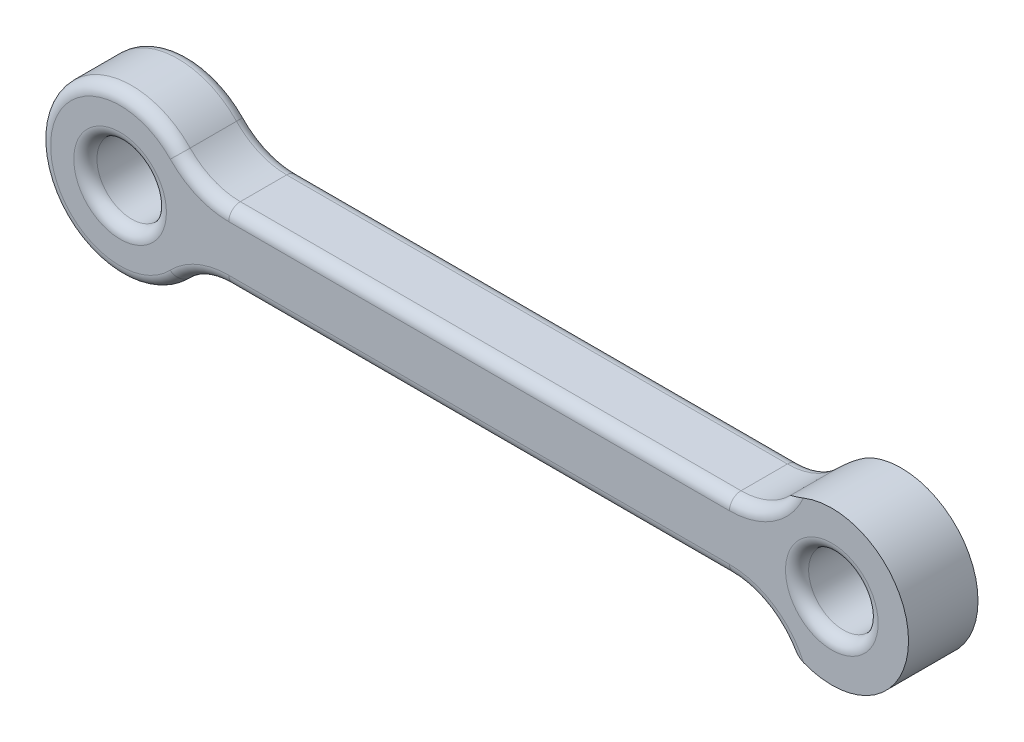
ISO-10303-21;
HEADER;
FILE_DESCRIPTION(('STEP AP214'),'2;1');
FILE_NAME('part.step','',(''),(''),'','','');
FILE_SCHEMA(('AUTOMOTIVE_DESIGN { 1 0 10303 214 1 1 1 1 }'));
ENDSEC;
DATA;
#1=APPLICATION_CONTEXT('core data for automotive mechanical design processes');
#2=APPLICATION_PROTOCOL_DEFINITION('international standard','automotive_design',2000,#1);
#3=PRODUCT_CONTEXT('',#1,'mechanical');
#4=PRODUCT('Part','Part','',(#3));
#5=PRODUCT_RELATED_PRODUCT_CATEGORY('part','',(#4));
#6=PRODUCT_DEFINITION_FORMATION('','',#4);
#7=PRODUCT_DEFINITION_CONTEXT('part definition',#1,'design');
#8=PRODUCT_DEFINITION('design','',#6,#7);
#9=PRODUCT_DEFINITION_SHAPE('','',#8);
#10=(LENGTH_UNIT() NAMED_UNIT(*) SI_UNIT(.MILLI.,.METRE.));
#11=(NAMED_UNIT(*) PLANE_ANGLE_UNIT() SI_UNIT($,.RADIAN.));
#12=(NAMED_UNIT(*) SI_UNIT($,.STERADIAN.) SOLID_ANGLE_UNIT());
#13=UNCERTAINTY_MEASURE_WITH_UNIT(LENGTH_MEASURE(1.E-05),#10,'distance_accuracy_value','');
#14=(GEOMETRIC_REPRESENTATION_CONTEXT(3) GLOBAL_UNCERTAINTY_ASSIGNED_CONTEXT((#13)) GLOBAL_UNIT_ASSIGNED_CONTEXT((#10,
#11,#12)) REPRESENTATION_CONTEXT('',''));
#15=CARTESIAN_POINT('',(0.,0.,0.));
#16=DIRECTION('',(0.,0.,1.));
#17=DIRECTION('',(1.,0.,0.));
#18=AXIS2_PLACEMENT_3D('',#15,#16,#17);
#19=CARTESIAN_POINT('',(36.507363881839,8.54999798456547,-4.34824322805021));
#20=DIRECTION('',(0.,0.,1.));
#21=DIRECTION('',(1.,0.,0.));
#22=AXIS2_PLACEMENT_3D('',#19,#20,#21);
#23=CYLINDRICAL_SURFACE('',#22,5.7);
#24=DIRECTION('',(0.,0.,1.));
#25=VECTOR('',#24,1.);
#26=CARTESIAN_POINT('',(40.6204977019919,4.60384413841163,-4.34824322805021));
#27=LINE('',#26,#25);
#28=CARTESIAN_POINT('',(40.6204977019919,4.60384413841163,-3.39824322805021));
#29=VERTEX_POINT('',#28);
#30=CARTESIAN_POINT('',(40.6204977019919,4.60384413841163,0.401756771949787));
#31=VERTEX_POINT('',#30);
#32=EDGE_CURVE('E150',#29,#31,#27,.T.);
#33=ORIENTED_EDGE('',*,*,#32,.F.);
#34=CARTESIAN_POINT('',(36.507363881839,8.54999798456547,-3.39824322805021));
#35=DIRECTION('',(0.,0.,1.));
#36=DIRECTION('',(1.,0.,0.));
#37=AXIS2_PLACEMENT_3D('',#34,#35,#36);
#38=CIRCLE('',#37,5.7);
#39=CARTESIAN_POINT('',(36.507363881839,2.84999798456547,-3.39824322805021));
#40=VERTEX_POINT('',#39);
#41=EDGE_CURVE('E163',#29,#40,#38,.F.);
#42=ORIENTED_EDGE('',*,*,#41,.T.);
#43=DIRECTION('',(0.,0.,1.));
#44=VECTOR('',#43,1.);
#45=CARTESIAN_POINT('',(36.507363881839,2.84999798456547,-4.34824322805021));
#46=LINE('',#45,#44);
#47=CARTESIAN_POINT('',(36.507363881839,2.84999798456547,0.401756771949787));
#48=VERTEX_POINT('',#47);
#49=EDGE_CURVE('E352',#40,#48,#46,.T.);
#50=ORIENTED_EDGE('',*,*,#49,.T.);
#51=CARTESIAN_POINT('',(36.507363881839,8.54999798456547,0.401756771949787));
#52=DIRECTION('',(0.,0.,1.));
#53=DIRECTION('',(1.,0.,0.));
#54=AXIS2_PLACEMENT_3D('',#51,#52,#53);
#55=CIRCLE('',#54,5.7);
#56=EDGE_CURVE('E166',#48,#31,#55,.T.);
#57=ORIENTED_EDGE('',*,*,#56,.T.);
#58=EDGE_LOOP('',(#33,#42,#50,#57));
#59=FACE_BOUND('',#58,.T.);
#60=ADVANCED_FACE('F34',(#59),#23,.F.);
#61=CARTESIAN_POINT('',(44.9061538255036,-2.01543452817728E-06,-4.34824322805021));
#62=DIRECTION('',(0.,0.,1.));
#63=DIRECTION('',(1.,0.,0.));
#64=AXIS2_PLACEMENT_3D('',#61,#62,#63);
#65=CYLINDRICAL_SURFACE('',#64,6.28985276594588);
#66=CARTESIAN_POINT('',(44.9061538255036,-2.01543452817728E-06,-4.34824322805021));
#67=DIRECTION('',(0.,0.,1.));
#68=DIRECTION('',(1.,0.,0.));
#69=AXIS2_PLACEMENT_3D('',#66,#67,#68);
#70=CIRCLE('',#69,6.28985276594588);
#71=CARTESIAN_POINT('',(42.5822666346649,-5.84481134864062,-4.34824322805021));
#72=VERTEX_POINT('',#71);
#73=CARTESIAN_POINT('',(42.5822666346649,5.84480731777156,-4.34824322805021));
#74=VERTEX_POINT('',#73);
#75=EDGE_CURVE('E153',#72,#74,#70,.T.);
#76=ORIENTED_EDGE('',*,*,#75,.T.);
#77=CARTESIAN_POINT('',(42.5822666346649,5.84480731777156,-4.34824322805021));
#78=CARTESIAN_POINT('',(42.5242618563185,5.82175204910267,-4.34822515141585));
#79=CARTESIAN_POINT('',(42.4666746223335,5.79784858913652,-4.34524316438347));
#80=CARTESIAN_POINT('',(42.3527633507371,5.74858595511516,-4.33416356835211));
#81=CARTESIAN_POINT('',(42.2964368465661,5.72323004728076,-4.32607705706841));
#82=CARTESIAN_POINT('',(42.1856638687273,5.67140875915757,-4.30567512232448));
#83=CARTESIAN_POINT('',(42.1312059977327,5.64495381874012,-4.29339387879264));
#84=CARTESIAN_POINT('',(42.0237939570263,5.59087148781972,-4.26522584736886));
#85=CARTESIAN_POINT('',(41.9708408061495,5.56324333309582,-4.24933667908465));
#86=CARTESIAN_POINT('',(41.8221034724079,5.48296479256332,-4.19970011858928));
#87=CARTESIAN_POINT('',(41.7282340708054,5.42903592653977,-4.16226529448975));
#88=CARTESIAN_POINT('',(41.5458123056734,5.31805875802067,-4.07982154740148));
#89=CARTESIAN_POINT('',(41.4572643512373,5.2610079416034,-4.03480645804254));
#90=CARTESIAN_POINT('',(41.2848725540442,5.1438751997565,-3.93906267830923));
#91=CARTESIAN_POINT('',(41.2010474649142,5.08378277401554,-3.88831332722491));
#92=CARTESIAN_POINT('',(41.0381411029469,4.96095603141131,-3.78272378725785));
#93=CARTESIAN_POINT('',(40.959057323986,4.89822314061,-3.72788579453001));
#94=CARTESIAN_POINT('',(40.8453620579264,4.80359528587045,-3.64302819488221));
#95=CARTESIAN_POINT('',(40.8088171468472,4.77245238138413,-3.61476708299693));
#96=CARTESIAN_POINT('',(40.7504107057862,4.72153962964591,-3.56671383655738));
#97=CARTESIAN_POINT('',(40.7280357677093,4.7017461442844,-3.54757259428625));
#98=CARTESIAN_POINT('',(40.6924047935437,4.66978508713483,-3.5144124247386));
#99=CARTESIAN_POINT('',(40.6787625997997,4.65743444145288,-3.50102627191423));
#100=CARTESIAN_POINT('',(40.6592910947883,4.63966229324642,-3.47925716911045));
#101=CARTESIAN_POINT('',(40.6529359231323,4.6338360003273,-3.47167589167288));
#102=CARTESIAN_POINT('',(40.64094571925,4.62280134877191,-3.45552743347919));
#103=CARTESIAN_POINT('',(40.635306827475,4.61758969021817,-3.44696605456954));
#104=CARTESIAN_POINT('',(40.628969320766,4.61171632920766,-3.43418077629506));
#105=CARTESIAN_POINT('',(40.6274381296364,4.61029551728388,-3.43074380067925));
#106=CARTESIAN_POINT('',(40.6247442856036,4.60779392188491,-3.42362793846728));
#107=CARTESIAN_POINT('',(40.6235794422702,4.60671111772935,-3.41995065486843));
#108=CARTESIAN_POINT('',(40.6219801448462,4.60522378466562,-3.41328844419325));
#109=CARTESIAN_POINT('',(40.6214368282799,4.60471822463415,-3.41035349663978));
#110=CARTESIAN_POINT('',(40.6206899682158,4.60402311984708,-3.40436475071507));
#111=CARTESIAN_POINT('',(40.6204911325881,4.6038379538184,-3.40130988031463));
#112=CARTESIAN_POINT('',(40.6204977019919,4.60384413841163,-3.39824322805021));
#113=B_SPLINE_CURVE_WITH_KNOTS('',3,(#77,#78,#79,#80,#81,#82,#83,#84,#85,#86,#87,#88,#89,#90,
#91,#92,#93,#94,#95,#96,#97,#98,#99,#100,#101,#102,#103,#104,#105,#106,#107,#108,#109,#110,#111,
#112),.UNSPECIFIED.,.F.,.F.,(4,2,2,2,2,2,2,2,2,2,2,2,2,2,2,2,2,4),(0.,0.187072185321937,
0.373739052357077,0.558919819248967,0.744223119268283,1.08727931315702,1.43061593549753,
1.77523162456193,2.11966352363416,2.28676133383489,2.39318610297405,2.46134589936488,
2.49578051675705,2.53002091666069,2.54206010118796,2.55402586999796,2.5630721675609,
2.57224114939772),.UNSPECIFIED.);
#114=EDGE_CURVE('E147',#74,#29,#113,.T.);
#115=ORIENTED_EDGE('',*,*,#114,.T.);
#116=ORIENTED_EDGE('',*,*,#32,.T.);
#117=CARTESIAN_POINT('',(40.6204977019919,4.60384413841163,0.401756771949787));
#118=CARTESIAN_POINT('',(40.6204858693804,4.60383299452611,0.405469727053923));
#119=CARTESIAN_POINT('',(40.620779386017,4.60410636538471,0.409155465137005));
#120=CARTESIAN_POINT('',(40.6218547641134,4.60510712453065,0.416311365692683));
#121=CARTESIAN_POINT('',(40.6226257614643,4.6058244121492,0.419784484629862));
#122=CARTESIAN_POINT('',(40.6249476641261,4.60798287648919,0.427946509291284));
#123=CARTESIAN_POINT('',(40.6266904040677,4.60960181142327,0.432529760587125));
#124=CARTESIAN_POINT('',(40.6306671470762,4.61329067007513,0.441332025326628));
#125=CARTESIAN_POINT('',(40.6329064403375,4.61536544789263,0.445546377509347));
#126=CARTESIAN_POINT('',(40.644896642457,4.62645445202731,0.466121909048936));
#127=CARTESIAN_POINT('',(40.6566662314761,4.63727691501406,0.480193036958769));
#128=CARTESIAN_POINT('',(40.6811637973935,4.65961212007277,0.506785148334278));
#129=CARTESIAN_POINT('',(40.6938995850088,4.67113028989664,0.519290704535989));
#130=CARTESIAN_POINT('',(40.7323509740006,4.70560807873407,0.555154404179497));
#131=CARTESIAN_POINT('',(40.7588057162045,4.72895106329035,0.577424060185287));
#132=CARTESIAN_POINT('',(40.8125845861007,4.77558448348195,0.620941290658611));
#133=CARTESIAN_POINT('',(40.8399099982111,4.79887478151696,0.642187226803431));
#134=CARTESIAN_POINT('',(40.8951582804262,4.8451450089714,0.683874577308413));
#135=CARTESIAN_POINT('',(40.9230777776064,4.86812587843941,0.704319276084132));
#136=CARTESIAN_POINT('',(40.9795327360087,4.91377596131083,0.744638912574169));
#137=CARTESIAN_POINT('',(41.0080678458169,4.93644534102658,0.76451416101505));
#138=CARTESIAN_POINT('',(41.1113204122242,5.01700836525966,0.834715075878338));
#139=CARTESIAN_POINT('',(41.18779212466,5.07398205359427,0.883551423288489));
#140=CARTESIAN_POINT('',(41.3450421431309,5.18555866895236,0.977006774991059));
#141=CARTESIAN_POINT('',(41.4258234756812,5.24015987970276,1.02162275281196));
#142=CARTESIAN_POINT('',(41.5916575082006,5.34658828284597,1.10498374307163));
#143=CARTESIAN_POINT('',(41.6766932840772,5.39842499849608,1.14374988337509));
#144=CARTESIAN_POINT('',(41.8514347545614,5.49918896166012,1.2136235045875));
#145=CARTESIAN_POINT('',(41.9411356494258,5.54811909276127,1.24473867552976));
#146=CARTESIAN_POINT('',(42.1206269996037,5.64027501491988,1.2954589700484));
#147=CARTESIAN_POINT('',(42.2101849945424,5.68366402211963,1.31556524676431));
#148=CARTESIAN_POINT('',(42.347488232458,5.7461300015814,1.33667465308559));
#149=CARTESIAN_POINT('',(42.3939186714196,5.7665828967427,1.34220609390733));
#150=CARTESIAN_POINT('',(42.4875633635927,5.80648310759377,1.34974586982785));
#151=CARTESIAN_POINT('',(42.5347786168032,5.8259289856779,1.35174929601289));
#152=CARTESIAN_POINT('',(42.5822666346649,5.84480731777156,1.35175677194979));
#153=B_SPLINE_CURVE_WITH_KNOTS('',3,(#117,#118,#119,#120,#121,#122,#123,#124,#125,#126,#127,
#128,#129,#130,#131,#132,#133,#134,#135,#136,#137,#138,#139,#140,#141,#142,#143,#144,#145,#146,
#147,#148,#149,#150,#151,#152),.UNSPECIFIED.,.F.,.F.,(4,2,2,2,2,2,2,2,2,2,2,2,2,2,2,2,2,4),(0.,
0.0110739084922642,0.0219046668590552,0.0373073278328187,0.0528827253417691,0.116116367250972,
0.179930883142027,0.30491919696137,0.430101310650094,0.554700754135241,0.679230861196915,
1.00045851346037,1.32191480232596,1.64218076968114,1.96212350785099,2.26593791227511,
2.41892334464954,2.57212147474342),.UNSPECIFIED.);
#154=CARTESIAN_POINT('',(42.5822666346649,5.84480731777156,1.35175677194979));
#155=VERTEX_POINT('',#154);
#156=EDGE_CURVE('E202',#31,#155,#153,.T.);
#157=ORIENTED_EDGE('',*,*,#156,.T.);
#158=CARTESIAN_POINT('',(44.9061538255036,-2.01543452817728E-06,1.35175677194979));
#159=DIRECTION('',(0.,0.,1.));
#160=DIRECTION('',(1.,0.,0.));
#161=AXIS2_PLACEMENT_3D('',#158,#159,#160);
#162=CIRCLE('',#161,6.28985276594588);
#163=CARTESIAN_POINT('',(42.5822666346649,-5.84481134864062,1.35175677194979));
#164=VERTEX_POINT('',#163);
#165=EDGE_CURVE('E347',#164,#155,#162,.T.);
#166=ORIENTED_EDGE('',*,*,#165,.F.);
#167=CARTESIAN_POINT('',(42.5822666346649,-5.84481134864062,1.35175677194979));
#168=CARTESIAN_POINT('',(42.5242618563185,-5.82175607997173,1.35173869531543));
#169=CARTESIAN_POINT('',(42.4666746223335,-5.79785262000558,1.34875670828305));
#170=CARTESIAN_POINT('',(42.3527633507371,-5.74858998598422,1.33767711225168));
#171=CARTESIAN_POINT('',(42.2964368465661,-5.72323407814981,1.32959060096798));
#172=CARTESIAN_POINT('',(42.1856638687273,-5.67141279002663,1.30918866622405));
#173=CARTESIAN_POINT('',(42.1312059977327,-5.64495784960917,1.29690742269221));
#174=CARTESIAN_POINT('',(42.0237939570263,-5.59087551868877,1.26873939126844));
#175=CARTESIAN_POINT('',(41.9708408061495,-5.56324736396488,1.25285022298422));
#176=CARTESIAN_POINT('',(41.8221034724079,-5.48296882343237,1.20321366248886));
#177=CARTESIAN_POINT('',(41.7282340708054,-5.42903995740883,1.16577883838932));
#178=CARTESIAN_POINT('',(41.5458123056735,-5.31806278888973,1.08333509130105));
#179=CARTESIAN_POINT('',(41.4572643512373,-5.26101197247245,1.03832000194212));
#180=CARTESIAN_POINT('',(41.2848725540442,-5.14387923062555,0.942576222208803));
#181=CARTESIAN_POINT('',(41.2010474649142,-5.0837868048846,0.891826871124481));
#182=CARTESIAN_POINT('',(41.0381411029469,-4.96096006228036,0.786237331157426));
#183=CARTESIAN_POINT('',(40.959057323986,-4.89822717147906,0.731399338429579));
#184=CARTESIAN_POINT('',(40.8453620579265,-4.80359931673953,0.646541738781803));
#185=CARTESIAN_POINT('',(40.8088171468473,-4.77245641225323,0.618280626896551));
#186=CARTESIAN_POINT('',(40.7504107057863,-4.72154366051503,0.570227380457024));
#187=CARTESIAN_POINT('',(40.7280357677094,-4.70175017515352,0.551086138185899));
#188=CARTESIAN_POINT('',(40.6924047935438,-4.66978911800395,0.517925968638235));
#189=CARTESIAN_POINT('',(40.6787625997998,-4.657438472322,0.504539815813861));
#190=CARTESIAN_POINT('',(40.6592910947883,-4.63966632411552,0.482770713010082));
#191=CARTESIAN_POINT('',(40.6529359231324,-4.63384003119639,0.475189435572518));
#192=CARTESIAN_POINT('',(40.64094571925,-4.62280537964101,0.459040977378818));
#193=CARTESIAN_POINT('',(40.6353068274751,-4.61759372108727,0.450479598469155));
#194=CARTESIAN_POINT('',(40.628969320766,-4.61172036007674,0.437694320194676));
#195=CARTESIAN_POINT('',(40.6274381296364,-4.61029954815296,0.434257344578873));
#196=CARTESIAN_POINT('',(40.6247442856036,-4.60779795275398,0.427141482366901));
#197=CARTESIAN_POINT('',(40.6235794422702,-4.60671514859842,0.423464198768058));
#198=CARTESIAN_POINT('',(40.6219801448462,-4.60522781553467,0.41680198809287));
#199=CARTESIAN_POINT('',(40.6214368282799,-4.60472225550319,0.413867040539391));
#200=CARTESIAN_POINT('',(40.6206899682158,-4.60402715071611,0.407878294614674));
#201=CARTESIAN_POINT('',(40.6204911325881,-4.60384198468743,0.40482342421422));
#202=CARTESIAN_POINT('',(40.6204977019919,-4.60384816928067,0.401756771949791));
#203=B_SPLINE_CURVE_WITH_KNOTS('',3,(#167,#168,#169,#170,#171,#172,#173,#174,#175,#176,#177,
#178,#179,#180,#181,#182,#183,#184,#185,#186,#187,#188,#189,#190,#191,#192,#193,#194,#195,#196,
#197,#198,#199,#200,#201,#202),.UNSPECIFIED.,.F.,.F.,(4,2,2,2,2,2,2,2,2,2,2,2,2,2,2,2,2,4),(0.,
0.187072185321944,0.373739052357085,0.558919819248975,0.744223119268284,1.08727931315701,
1.43061593549753,1.77523162456193,2.11966352363416,2.28676133383477,2.39318610297392,
2.46134589936479,2.49578051675697,2.53002091666063,2.54206010118791,2.55402586999791,
2.56307216756087,2.57224114939773),.UNSPECIFIED.);
#204=CARTESIAN_POINT('',(40.6204977019919,-4.60384816928068,0.401756771949787));
#205=VERTEX_POINT('',#204);
#206=EDGE_CURVE('E194',#164,#205,#203,.T.);
#207=ORIENTED_EDGE('',*,*,#206,.T.);
#208=DIRECTION('',(0.,0.,1.));
#209=VECTOR('',#208,1.);
#210=CARTESIAN_POINT('',(40.6204977019919,-4.60384816928068,-4.34824322805021));
#211=LINE('',#210,#209);
#212=CARTESIAN_POINT('',(40.6204977019919,-4.60384816928068,-3.39824322805021));
#213=VERTEX_POINT('',#212);
#214=EDGE_CURVE('E167',#213,#205,#211,.T.);
#215=ORIENTED_EDGE('',*,*,#214,.F.);
#216=CARTESIAN_POINT('',(40.6204977019919,-4.60384816928068,-3.39824322805021));
#217=CARTESIAN_POINT('',(40.6204858693804,-4.60383702539517,-3.40195618315435));
#218=CARTESIAN_POINT('',(40.6207793860169,-4.60411039625377,-3.40564192123743));
#219=CARTESIAN_POINT('',(40.6218547641134,-4.60511115539971,-3.41279782179311));
#220=CARTESIAN_POINT('',(40.6226257614643,-4.60582844301827,-3.41627094073029));
#221=CARTESIAN_POINT('',(40.6249476641261,-4.60798690735825,-3.42443296539171));
#222=CARTESIAN_POINT('',(40.6266904040677,-4.60960584229233,-3.42901621668754));
#223=CARTESIAN_POINT('',(40.6306671470762,-4.61329470094418,-3.43781848142704));
#224=CARTESIAN_POINT('',(40.6329064403374,-4.61536947876168,-3.44203283360976));
#225=CARTESIAN_POINT('',(40.644896642457,-4.62645848289633,-3.46260836514933));
#226=CARTESIAN_POINT('',(40.6566662314761,-4.63728094588307,-3.47667949305915));
#227=CARTESIAN_POINT('',(40.6811637973935,-4.65961615094176,-3.50327160443464));
#228=CARTESIAN_POINT('',(40.6938995850088,-4.67113432076563,-3.51577716063634));
#229=CARTESIAN_POINT('',(40.7323509740005,-4.70561210960303,-3.55164086027983));
#230=CARTESIAN_POINT('',(40.7588057162044,-4.72895509415929,-3.5739105162856));
#231=CARTESIAN_POINT('',(40.8125845861005,-4.77558851435085,-3.61742774675889));
#232=CARTESIAN_POINT('',(40.8399099982109,-4.79887881238585,-3.6386736829037));
#233=CARTESIAN_POINT('',(40.895158280426,-4.84514903984024,-3.68036103340865));
#234=CARTESIAN_POINT('',(40.9230777776061,-4.86812990930824,-3.70080573218435));
#235=CARTESIAN_POINT('',(40.9795327360084,-4.91377999217962,-3.74112536867436));
#236=CARTESIAN_POINT('',(41.0080678458166,-4.93644937189534,-3.76100061711522));
#237=CARTESIAN_POINT('',(41.1113204122238,-5.01701239612841,-3.8312015319785));
#238=CARTESIAN_POINT('',(41.1877921246596,-5.07398608446301,-3.88003787938865));
#239=CARTESIAN_POINT('',(41.3450421431304,-5.18556269982111,-3.97349323109123));
#240=CARTESIAN_POINT('',(41.4258234756807,-5.24016391057152,-4.01810920891214));
#241=CARTESIAN_POINT('',(41.5916575082002,-5.34659231371473,-4.10147019917183));
#242=CARTESIAN_POINT('',(41.6766932840768,-5.39842902936486,-4.1402363394753));
#243=CARTESIAN_POINT('',(41.8514347545609,-5.4991929925289,-4.21010996068775));
#244=CARTESIAN_POINT('',(41.9411356494253,-5.54812312363005,-4.24122513163002));
#245=CARTESIAN_POINT('',(42.1206269996032,-5.64027904578873,-4.29194542614872));
#246=CARTESIAN_POINT('',(42.2101849945421,-5.68366805298853,-4.31205170286467));
#247=CARTESIAN_POINT('',(42.3474882324578,-5.74613403245037,-4.33316110918599));
#248=CARTESIAN_POINT('',(42.3939186714194,-5.76658692761169,-4.33869255000773));
#249=CARTESIAN_POINT('',(42.4875633635926,-5.80648713846279,-4.34623232592827));
#250=CARTESIAN_POINT('',(42.5347786168031,-5.82593301654694,-4.34823575211331));
#251=CARTESIAN_POINT('',(42.5822666346649,-5.84481134864062,-4.34824322805021));
#252=B_SPLINE_CURVE_WITH_KNOTS('',3,(#216,#217,#218,#219,#220,#221,#222,#223,#224,#225,#226,
#227,#228,#229,#230,#231,#232,#233,#234,#235,#236,#237,#238,#239,#240,#241,#242,#243,#244,#245,
#246,#247,#248,#249,#250,#251),.UNSPECIFIED.,.F.,.F.,(4,2,2,2,2,2,2,2,2,2,2,2,2,2,2,2,2,4),(0.,
0.011073908492264,0.0219046668590601,0.037307327832808,0.0528827253417396,0.116116367250877,
0.179930883141882,0.304919196961123,0.430101310649748,0.554700754134783,0.67923086119634,
1.00045851345979,1.32191480232537,1.64218076968055,1.96212350785041,2.26593791227483,
2.4189233446494,2.57212147474342),.UNSPECIFIED.);
#253=EDGE_CURVE('E158',#213,#72,#252,.T.);
#254=ORIENTED_EDGE('',*,*,#253,.T.);
#255=EDGE_LOOP('',(#76,#115,#116,#157,#166,#207,#215,#254));
#256=FACE_BOUND('',#255,.T.);
#257=ADVANCED_FACE('F149',(#256),#65,.T.);
#258=CARTESIAN_POINT('',(36.507363881839,-8.55000201543453,-4.34824322805021));
#259=DIRECTION('',(0.,0.,1.));
#260=DIRECTION('',(1.,0.,0.));
#261=AXIS2_PLACEMENT_3D('',#258,#259,#260);
#262=CYLINDRICAL_SURFACE('',#261,5.7);
#263=DIRECTION('',(0.,0.,1.));
#264=VECTOR('',#263,1.);
#265=CARTESIAN_POINT('',(36.507363881839,-2.85000201543453,-4.34824322805021));
#266=LINE('',#265,#264);
#267=CARTESIAN_POINT('',(36.507363881839,-2.85000201543453,-3.39824322805021));
#268=VERTEX_POINT('',#267);
#269=CARTESIAN_POINT('',(36.507363881839,-2.85000201543453,0.401756771949787));
#270=VERTEX_POINT('',#269);
#271=EDGE_CURVE('E358',#268,#270,#266,.T.);
#272=ORIENTED_EDGE('',*,*,#271,.F.);
#273=CARTESIAN_POINT('',(36.507363881839,-8.55000201543453,-3.39824322805021));
#274=DIRECTION('',(0.,0.,1.));
#275=DIRECTION('',(1.,0.,0.));
#276=AXIS2_PLACEMENT_3D('',#273,#274,#275);
#277=CIRCLE('',#276,5.7);
#278=EDGE_CURVE('E259',#268,#213,#277,.F.);
#279=ORIENTED_EDGE('',*,*,#278,.T.);
#280=ORIENTED_EDGE('',*,*,#214,.T.);
#281=CARTESIAN_POINT('',(36.507363881839,-8.55000201543453,0.401756771949787));
#282=DIRECTION('',(0.,0.,1.));
#283=DIRECTION('',(1.,0.,0.));
#284=AXIS2_PLACEMENT_3D('',#281,#282,#283);
#285=CIRCLE('',#284,5.7);
#286=EDGE_CURVE('E157',#205,#270,#285,.T.);
#287=ORIENTED_EDGE('',*,*,#286,.T.);
#288=EDGE_LOOP('',(#272,#279,#280,#287));
#289=FACE_BOUND('',#288,.T.);
#290=ADVANCED_FACE('F238',(#289),#262,.F.);
#291=CARTESIAN_POINT('',(-4.56905623083193,-2.85000201543453,-4.34824322805021));
#292=DIRECTION('',(0.,-1.,0.));
#293=DIRECTION('',(0.,0.,-1.));
#294=AXIS2_PLACEMENT_3D('',#291,#292,#293);
#295=PLANE('',#294);
#296=DIRECTION('',(0.,0.,1.));
#297=VECTOR('',#296,1.);
#298=CARTESIAN_POINT('',(-4.56905623083193,-2.85000201543453,-4.34824322805021));
#299=LINE('',#298,#297);
#300=CARTESIAN_POINT('',(-4.56905623083193,-2.85000201543453,-3.39824322805021));
#301=VERTEX_POINT('',#300);
#302=CARTESIAN_POINT('',(-4.56905623083193,-2.85000201543453,0.401756771949787));
#303=VERTEX_POINT('',#302);
#304=EDGE_CURVE('E361',#301,#303,#299,.T.);
#305=ORIENTED_EDGE('',*,*,#304,.F.);
#306=DIRECTION('',(1.,0.,0.));
#307=VECTOR('',#306,1.);
#308=CARTESIAN_POINT('',(36.507363881839,-2.85000201543453,-3.39824322805021));
#309=LINE('',#308,#307);
#310=EDGE_CURVE('E263',#301,#268,#309,.T.);
#311=ORIENTED_EDGE('',*,*,#310,.T.);
#312=ORIENTED_EDGE('',*,*,#271,.T.);
#313=DIRECTION('',(1.,0.,0.));
#314=VECTOR('',#313,1.);
#315=CARTESIAN_POINT('',(-4.56905623083193,-2.85000201543453,0.401756771949787));
#316=LINE('',#315,#314);
#317=EDGE_CURVE('E261',#270,#303,#316,.F.);
#318=ORIENTED_EDGE('',*,*,#317,.T.);
#319=EDGE_LOOP('',(#305,#311,#312,#318));
#320=FACE_BOUND('',#319,.T.);
#321=ADVANCED_FACE('F420',(#320),#295,.T.);
#322=CARTESIAN_POINT('',(-4.56905623083193,-8.55000201543453,-4.34824322805021));
#323=DIRECTION('',(0.,0.,1.));
#324=DIRECTION('',(1.,0.,0.));
#325=AXIS2_PLACEMENT_3D('',#322,#323,#324);
#326=CYLINDRICAL_SURFACE('',#325,5.7);
#327=DIRECTION('',(0.,0.,1.));
#328=VECTOR('',#327,1.);
#329=CARTESIAN_POINT('',(-8.68219005098478,-4.60384816928068,-4.34824322805021));
#330=LINE('',#329,#328);
#331=CARTESIAN_POINT('',(-8.68219005098478,-4.60384816928068,-3.39824322805021));
#332=VERTEX_POINT('',#331);
#333=CARTESIAN_POINT('',(-8.68219005098478,-4.60384816928068,0.401756771949787));
#334=VERTEX_POINT('',#333);
#335=EDGE_CURVE('E364',#332,#334,#330,.T.);
#336=ORIENTED_EDGE('',*,*,#335,.F.);
#337=CARTESIAN_POINT('',(-4.56905623083193,-8.55000201543453,-3.39824322805021));
#338=DIRECTION('',(0.,0.,1.));
#339=DIRECTION('',(1.,0.,0.));
#340=AXIS2_PLACEMENT_3D('',#337,#338,#339);
#341=CIRCLE('',#340,5.7);
#342=EDGE_CURVE('E267',#332,#301,#341,.F.);
#343=ORIENTED_EDGE('',*,*,#342,.T.);
#344=ORIENTED_EDGE('',*,*,#304,.T.);
#345=CARTESIAN_POINT('',(-4.56905623083193,-8.55000201543453,0.401756771949787));
#346=DIRECTION('',(0.,0.,1.));
#347=DIRECTION('',(1.,0.,0.));
#348=AXIS2_PLACEMENT_3D('',#345,#346,#347);
#349=CIRCLE('',#348,5.7);
#350=EDGE_CURVE('E265',#303,#334,#349,.T.);
#351=ORIENTED_EDGE('',*,*,#350,.T.);
#352=EDGE_LOOP('',(#336,#343,#344,#351));
#353=FACE_BOUND('',#352,.T.);
#354=ADVANCED_FACE('F393',(#353),#326,.F.);
#355=CARTESIAN_POINT('',(-13.4808461744964,-2.01543452817728E-06,-4.34824322805021));
#356=DIRECTION('',(0.,0.,1.));
#357=DIRECTION('',(1.,0.,0.));
#358=AXIS2_PLACEMENT_3D('',#355,#356,#357);
#359=CYLINDRICAL_SURFACE('',#358,6.65);
#360=DIRECTION('',(0.,0.,1.));
#361=VECTOR('',#360,1.);
#362=CARTESIAN_POINT('',(-8.68219005098478,4.60384413841163,-4.34824322805021));
#363=LINE('',#362,#361);
#364=CARTESIAN_POINT('',(-8.68219005098478,4.60384413841163,-3.39824322805021));
#365=VERTEX_POINT('',#364);
#366=CARTESIAN_POINT('',(-8.68219005098478,4.60384413841163,0.401756771949787));
#367=VERTEX_POINT('',#366);
#368=EDGE_CURVE('E367',#365,#367,#363,.T.);
#369=ORIENTED_EDGE('',*,*,#368,.F.);
#370=CARTESIAN_POINT('',(-13.4808461744964,-2.01543452817728E-06,-3.39824322805021));
#371=DIRECTION('',(0.,0.,1.));
#372=DIRECTION('',(1.,0.,0.));
#373=AXIS2_PLACEMENT_3D('',#370,#371,#372);
#374=CIRCLE('',#373,6.65);
#375=EDGE_CURVE('E271',#365,#332,#374,.T.);
#376=ORIENTED_EDGE('',*,*,#375,.T.);
#377=ORIENTED_EDGE('',*,*,#335,.T.);
#378=CARTESIAN_POINT('',(-13.4808461744964,-2.01543452817728E-06,0.401756771949787));
#379=DIRECTION('',(0.,0.,1.));
#380=DIRECTION('',(1.,0.,0.));
#381=AXIS2_PLACEMENT_3D('',#378,#379,#380);
#382=CIRCLE('',#381,6.65);
#383=EDGE_CURVE('E269',#334,#367,#382,.F.);
#384=ORIENTED_EDGE('',*,*,#383,.T.);
#385=EDGE_LOOP('',(#369,#376,#377,#384));
#386=FACE_BOUND('',#385,.T.);
#387=ADVANCED_FACE('F398',(#386),#359,.T.);
#388=CARTESIAN_POINT('',(-4.56905623083193,8.54999798456547,-4.34824322805021));
#389=DIRECTION('',(0.,0.,1.));
#390=DIRECTION('',(1.,0.,0.));
#391=AXIS2_PLACEMENT_3D('',#388,#389,#390);
#392=CYLINDRICAL_SURFACE('',#391,5.7);
#393=DIRECTION('',(0.,0.,1.));
#394=VECTOR('',#393,1.);
#395=CARTESIAN_POINT('',(-4.56905623083193,2.84999798456547,-4.34824322805021));
#396=LINE('',#395,#394);
#397=CARTESIAN_POINT('',(-4.56905623083193,2.84999798456547,-3.39824322805021));
#398=VERTEX_POINT('',#397);
#399=CARTESIAN_POINT('',(-4.56905623083193,2.84999798456547,0.401756771949787));
#400=VERTEX_POINT('',#399);
#401=EDGE_CURVE('E370',#398,#400,#396,.T.);
#402=ORIENTED_EDGE('',*,*,#401,.F.);
#403=CARTESIAN_POINT('',(-4.56905623083193,8.54999798456547,-3.39824322805021));
#404=DIRECTION('',(0.,0.,1.));
#405=DIRECTION('',(1.,0.,0.));
#406=AXIS2_PLACEMENT_3D('',#403,#404,#405);
#407=CIRCLE('',#406,5.7);
#408=EDGE_CURVE('E275',#398,#365,#407,.F.);
#409=ORIENTED_EDGE('',*,*,#408,.T.);
#410=ORIENTED_EDGE('',*,*,#368,.T.);
#411=CARTESIAN_POINT('',(-4.56905623083193,8.54999798456547,0.401756771949787));
#412=DIRECTION('',(0.,0.,1.));
#413=DIRECTION('',(1.,0.,0.));
#414=AXIS2_PLACEMENT_3D('',#411,#412,#413);
#415=CIRCLE('',#414,5.7);
#416=EDGE_CURVE('E273',#367,#400,#415,.T.);
#417=ORIENTED_EDGE('',*,*,#416,.T.);
#418=EDGE_LOOP('',(#402,#409,#410,#417));
#419=FACE_BOUND('',#418,.T.);
#420=ADVANCED_FACE('F434',(#419),#392,.F.);
#421=CARTESIAN_POINT('',(-4.56905623083193,2.84999798456547,-4.34824322805021));
#422=DIRECTION('',(0.,1.,0.));
#423=DIRECTION('',(0.,0.,1.));
#424=AXIS2_PLACEMENT_3D('',#421,#422,#423);
#425=PLANE('',#424);
#426=ORIENTED_EDGE('',*,*,#49,.F.);
#427=DIRECTION('',(-1.,0.,0.));
#428=VECTOR('',#427,1.);
#429=CARTESIAN_POINT('',(-4.56905623083193,2.84999798456547,-3.39824322805021));
#430=LINE('',#429,#428);
#431=EDGE_CURVE('E11',#40,#398,#430,.T.);
#432=ORIENTED_EDGE('',*,*,#431,.T.);
#433=ORIENTED_EDGE('',*,*,#401,.T.);
#434=DIRECTION('',(-1.,0.,0.));
#435=VECTOR('',#434,1.);
#436=CARTESIAN_POINT('',(-4.56905623083193,2.84999798456547,0.401756771949787));
#437=LINE('',#436,#435);
#438=EDGE_CURVE('E43',#400,#48,#437,.F.);
#439=ORIENTED_EDGE('',*,*,#438,.T.);
#440=EDGE_LOOP('',(#426,#432,#433,#439));
#441=FACE_BOUND('',#440,.T.);
#442=ADVANCED_FACE('F241',(#441),#425,.T.);
#443=CARTESIAN_POINT('',(36.507363881839,8.54999798456547,-4.34824322805021));
#444=DIRECTION('',(0.,0.,1.));
#445=DIRECTION('',(1.,0.,0.));
#446=AXIS2_PLACEMENT_3D('',#443,#444,#445);
#447=PLANE('',#446);
#448=CARTESIAN_POINT('',(44.9061538255036,-2.01543452817728E-06,-4.34824322805021));
#449=DIRECTION('',(0.,0.,1.));
#450=DIRECTION('',(1.,0.,0.));
#451=AXIS2_PLACEMENT_3D('',#448,#449,#450);
#452=CIRCLE('',#451,3.80000000000001);
#453=CARTESIAN_POINT('',(48.7061538255036,-2.01543452817728E-06,-4.34824322805021));
#454=VERTEX_POINT('',#453);
#455=EDGE_CURVE('E191',#454,#454,#452,.T.);
#456=ORIENTED_EDGE('',*,*,#455,.T.);
#457=EDGE_LOOP('',(#456));
#458=FACE_BOUND('',#457,.T.);
#459=CARTESIAN_POINT('',(-13.4808461744964,-2.01543452817728E-06,-4.34824322805021));
#460=DIRECTION('',(0.,0.,1.));
#461=DIRECTION('',(1.,0.,0.));
#462=AXIS2_PLACEMENT_3D('',#459,#460,#461);
#463=CIRCLE('',#462,2.85);
#464=CARTESIAN_POINT('',(-10.6308461744964,-2.01543452817728E-06,-4.34824322805021));
#465=VERTEX_POINT('',#464);
#466=EDGE_CURVE('E322',#465,#465,#463,.T.);
#467=ORIENTED_EDGE('',*,*,#466,.T.);
#468=EDGE_LOOP('',(#467));
#469=FACE_BOUND('',#468,.T.);
#470=DIRECTION('',(-1.,0.,0.));
#471=VECTOR('',#470,1.);
#472=CARTESIAN_POINT('',(36.507363881839,1.89999798456547,-4.34824322805021));
#473=LINE('',#472,#471);
#474=CARTESIAN_POINT('',(-4.56905623083193,1.89999798456547,-4.34824322805021));
#475=VERTEX_POINT('',#474);
#476=CARTESIAN_POINT('',(36.507363881839,1.89999798456547,-4.34824322805021));
#477=VERTEX_POINT('',#476);
#478=EDGE_CURVE('E173',#475,#477,#473,.F.);
#479=ORIENTED_EDGE('',*,*,#478,.T.);
#480=CARTESIAN_POINT('',(36.507363881839,8.54999798456547,-4.34824322805021));
#481=DIRECTION('',(0.,0.,1.));
#482=DIRECTION('',(1.,0.,0.));
#483=AXIS2_PLACEMENT_3D('',#480,#481,#482);
#484=CIRCLE('',#483,6.65);
#485=EDGE_CURVE('E189',#477,#74,#484,.T.);
#486=ORIENTED_EDGE('',*,*,#485,.T.);
#487=ORIENTED_EDGE('',*,*,#75,.F.);
#488=CARTESIAN_POINT('',(36.507363881839,-8.55000201543453,-4.34824322805021));
#489=DIRECTION('',(0.,0.,1.));
#490=DIRECTION('',(1.,0.,0.));
#491=AXIS2_PLACEMENT_3D('',#488,#489,#490);
#492=CIRCLE('',#491,6.65);
#493=CARTESIAN_POINT('',(36.507363881839,-1.90000201543453,-4.34824322805021));
#494=VERTEX_POINT('',#493);
#495=EDGE_CURVE('E187',#72,#494,#492,.T.);
#496=ORIENTED_EDGE('',*,*,#495,.T.);
#497=DIRECTION('',(1.,0.,0.));
#498=VECTOR('',#497,1.);
#499=CARTESIAN_POINT('',(-4.56905623083193,-1.90000201543453,-4.34824322805021));
#500=LINE('',#499,#498);
#501=CARTESIAN_POINT('',(-4.56905623083193,-1.90000201543453,-4.34824322805021));
#502=VERTEX_POINT('',#501);
#503=EDGE_CURVE('E185',#494,#502,#500,.F.);
#504=ORIENTED_EDGE('',*,*,#503,.T.);
#505=CARTESIAN_POINT('',(-4.56905623083193,-8.55000201543453,-4.34824322805021));
#506=DIRECTION('',(0.,0.,1.));
#507=DIRECTION('',(1.,0.,0.));
#508=AXIS2_PLACEMENT_3D('',#505,#506,#507);
#509=CIRCLE('',#508,6.65);
#510=CARTESIAN_POINT('',(-9.36771235434359,-3.94615586158838,-4.34824322805021));
#511=VERTEX_POINT('',#510);
#512=EDGE_CURVE('E183',#502,#511,#509,.T.);
#513=ORIENTED_EDGE('',*,*,#512,.T.);
#514=CARTESIAN_POINT('',(-13.4808461744964,-2.01543452817728E-06,-4.34824322805021));
#515=DIRECTION('',(0.,0.,1.));
#516=DIRECTION('',(1.,0.,0.));
#517=AXIS2_PLACEMENT_3D('',#514,#515,#516);
#518=CIRCLE('',#517,5.7);
#519=CARTESIAN_POINT('',(-9.36771235434359,3.94615183071932,-4.34824322805021));
#520=VERTEX_POINT('',#519);
#521=EDGE_CURVE('E181',#511,#520,#518,.F.);
#522=ORIENTED_EDGE('',*,*,#521,.T.);
#523=CARTESIAN_POINT('',(-4.56905623083193,8.54999798456547,-4.34824322805021));
#524=DIRECTION('',(0.,0.,1.));
#525=DIRECTION('',(1.,0.,0.));
#526=AXIS2_PLACEMENT_3D('',#523,#524,#525);
#527=CIRCLE('',#526,6.65);
#528=EDGE_CURVE('E175',#520,#475,#527,.T.);
#529=ORIENTED_EDGE('',*,*,#528,.T.);
#530=EDGE_LOOP('',(#479,#486,#487,#496,#504,#513,#522,#529));
#531=FACE_BOUND('',#530,.T.);
#532=ADVANCED_FACE('F412',(#458,#469,#531),#447,.F.);
#533=CARTESIAN_POINT('',(36.507363881839,8.54999798456547,1.35175677194979));
#534=DIRECTION('',(0.,0.,1.));
#535=DIRECTION('',(1.,0.,0.));
#536=AXIS2_PLACEMENT_3D('',#533,#534,#535);
#537=PLANE('',#536);
#538=CARTESIAN_POINT('',(-13.4808461744964,-2.01543452817728E-06,1.35175677194979));
#539=DIRECTION('',(0.,0.,1.));
#540=DIRECTION('',(1.,0.,0.));
#541=AXIS2_PLACEMENT_3D('',#538,#539,#540);
#542=CIRCLE('',#541,3.8);
#543=CARTESIAN_POINT('',(-9.68084617449645,-2.01543452817728E-06,1.35175677194979));
#544=VERTEX_POINT('',#543);
#545=EDGE_CURVE('E293',#544,#544,#542,.F.);
#546=ORIENTED_EDGE('',*,*,#545,.T.);
#547=EDGE_LOOP('',(#546));
#548=FACE_BOUND('',#547,.T.);
#549=CARTESIAN_POINT('',(44.9061538255036,-2.01543452817728E-06,1.35175677194979));
#550=DIRECTION('',(0.,0.,1.));
#551=DIRECTION('',(1.,0.,0.));
#552=AXIS2_PLACEMENT_3D('',#549,#550,#551);
#553=CIRCLE('',#552,3.80000000000001);
#554=CARTESIAN_POINT('',(48.7061538255036,-2.01543452817728E-06,1.35175677194979));
#555=VERTEX_POINT('',#554);
#556=EDGE_CURVE('E290',#555,#555,#553,.F.);
#557=ORIENTED_EDGE('',*,*,#556,.T.);
#558=EDGE_LOOP('',(#557));
#559=FACE_BOUND('',#558,.T.);
#560=ORIENTED_EDGE('',*,*,#165,.T.);
#561=CARTESIAN_POINT('',(36.507363881839,8.54999798456547,1.35175677194979));
#562=DIRECTION('',(0.,0.,1.));
#563=DIRECTION('',(1.,0.,0.));
#564=AXIS2_PLACEMENT_3D('',#561,#562,#563);
#565=CIRCLE('',#564,6.65);
#566=CARTESIAN_POINT('',(36.507363881839,1.89999798456547,1.35175677194979));
#567=VERTEX_POINT('',#566);
#568=EDGE_CURVE('E287',#155,#567,#565,.F.);
#569=ORIENTED_EDGE('',*,*,#568,.T.);
#570=DIRECTION('',(-1.,0.,0.));
#571=VECTOR('',#570,1.);
#572=CARTESIAN_POINT('',(36.507363881839,1.89999798456547,1.35175677194979));
#573=LINE('',#572,#571);
#574=CARTESIAN_POINT('',(-4.56905623083193,1.89999798456547,1.35175677194979));
#575=VERTEX_POINT('',#574);
#576=EDGE_CURVE('E277',#567,#575,#573,.T.);
#577=ORIENTED_EDGE('',*,*,#576,.T.);
#578=CARTESIAN_POINT('',(-4.56905623083193,8.54999798456547,1.35175677194979));
#579=DIRECTION('',(0.,0.,1.));
#580=DIRECTION('',(1.,0.,0.));
#581=AXIS2_PLACEMENT_3D('',#578,#579,#580);
#582=CIRCLE('',#581,6.65);
#583=CARTESIAN_POINT('',(-9.36771235434359,3.94615183071932,1.35175677194979));
#584=VERTEX_POINT('',#583);
#585=EDGE_CURVE('E279',#575,#584,#582,.F.);
#586=ORIENTED_EDGE('',*,*,#585,.T.);
#587=CARTESIAN_POINT('',(-13.4808461744964,-2.01543452817728E-06,1.35175677194979));
#588=DIRECTION('',(0.,0.,1.));
#589=DIRECTION('',(1.,0.,0.));
#590=AXIS2_PLACEMENT_3D('',#587,#588,#589);
#591=CIRCLE('',#590,5.7);
#592=CARTESIAN_POINT('',(-9.36771235434359,-3.94615586158838,1.35175677194979));
#593=VERTEX_POINT('',#592);
#594=EDGE_CURVE('E281',#584,#593,#591,.T.);
#595=ORIENTED_EDGE('',*,*,#594,.T.);
#596=CARTESIAN_POINT('',(-4.56905623083193,-8.55000201543453,1.35175677194979));
#597=DIRECTION('',(0.,0.,1.));
#598=DIRECTION('',(1.,0.,0.));
#599=AXIS2_PLACEMENT_3D('',#596,#597,#598);
#600=CIRCLE('',#599,6.65);
#601=CARTESIAN_POINT('',(-4.56905623083193,-1.90000201543453,1.35175677194979));
#602=VERTEX_POINT('',#601);
#603=EDGE_CURVE('E56',#593,#602,#600,.F.);
#604=ORIENTED_EDGE('',*,*,#603,.T.);
#605=DIRECTION('',(1.,0.,0.));
#606=VECTOR('',#605,1.);
#607=CARTESIAN_POINT('',(36.507363881839,-1.90000201543453,1.35175677194979));
#608=LINE('',#607,#606);
#609=CARTESIAN_POINT('',(36.507363881839,-1.90000201543453,1.35175677194979));
#610=VERTEX_POINT('',#609);
#611=EDGE_CURVE('E51',#602,#610,#608,.T.);
#612=ORIENTED_EDGE('',*,*,#611,.T.);
#613=CARTESIAN_POINT('',(36.507363881839,-8.55000201543453,1.35175677194979));
#614=DIRECTION('',(0.,0.,1.));
#615=DIRECTION('',(1.,0.,0.));
#616=AXIS2_PLACEMENT_3D('',#613,#614,#615);
#617=CIRCLE('',#616,6.65);
#618=EDGE_CURVE('E285',#610,#164,#617,.F.);
#619=ORIENTED_EDGE('',*,*,#618,.T.);
#620=EDGE_LOOP('',(#560,#569,#577,#586,#595,#604,#612,#619));
#621=FACE_BOUND('',#620,.T.);
#622=ADVANCED_FACE('F346',(#548,#559,#621),#537,.T.);
#623=CARTESIAN_POINT('',(-13.4808461744964,-2.01543452817728E-06,-4.34824322805021));
#624=DIRECTION('',(0.,0.,1.));
#625=DIRECTION('',(1.,0.,0.));
#626=AXIS2_PLACEMENT_3D('',#623,#624,#625);
#627=CYLINDRICAL_SURFACE('',#626,2.85);
#628=CARTESIAN_POINT('',(-13.4808461744964,-2.01543452817728E-06,0.401756771949787));
#629=DIRECTION('',(0.,0.,1.));
#630=DIRECTION('',(1.,0.,0.));
#631=AXIS2_PLACEMENT_3D('',#628,#629,#630);
#632=CIRCLE('',#631,2.85);
#633=CARTESIAN_POINT('',(-10.6308461744964,-2.01543452817728E-06,0.401756771949787));
#634=VERTEX_POINT('',#633);
#635=EDGE_CURVE('E296',#634,#634,#632,.T.);
#636=ORIENTED_EDGE('',*,*,#635,.T.);
#637=EDGE_LOOP('',(#636));
#638=FACE_BOUND('',#637,.T.);
#639=ORIENTED_EDGE('',*,*,#466,.F.);
#640=EDGE_LOOP('',(#639));
#641=FACE_BOUND('',#640,.T.);
#642=ADVANCED_FACE('F490',(#638,#641),#627,.F.);
#643=CARTESIAN_POINT('',(44.9061538255036,-2.01543452817728E-06,-4.34824322805021));
#644=DIRECTION('',(0.,0.,1.));
#645=DIRECTION('',(1.,0.,0.));
#646=AXIS2_PLACEMENT_3D('',#643,#644,#645);
#647=CYLINDRICAL_SURFACE('',#646,2.85000000000001);
#648=CARTESIAN_POINT('',(44.9061538255036,-2.01543452817728E-06,-3.39824322805021));
#649=DIRECTION('',(0.,0.,1.));
#650=DIRECTION('',(1.,0.,0.));
#651=AXIS2_PLACEMENT_3D('',#648,#649,#650);
#652=CIRCLE('',#651,2.85000000000001);
#653=CARTESIAN_POINT('',(47.7561538255036,-2.01543452817728E-06,-3.39824322805021));
#654=VERTEX_POINT('',#653);
#655=EDGE_CURVE('E302',#654,#654,#652,.F.);
#656=ORIENTED_EDGE('',*,*,#655,.T.);
#657=EDGE_LOOP('',(#656));
#658=FACE_BOUND('',#657,.T.);
#659=CARTESIAN_POINT('',(44.9061538255036,-2.01543452817728E-06,0.401756771949787));
#660=DIRECTION('',(0.,0.,1.));
#661=DIRECTION('',(1.,0.,0.));
#662=AXIS2_PLACEMENT_3D('',#659,#660,#661);
#663=CIRCLE('',#662,2.85000000000001);
#664=CARTESIAN_POINT('',(47.7561538255036,-2.01543452817728E-06,0.401756771949787));
#665=VERTEX_POINT('',#664);
#666=EDGE_CURVE('E299',#665,#665,#663,.T.);
#667=ORIENTED_EDGE('',*,*,#666,.T.);
#668=EDGE_LOOP('',(#667));
#669=FACE_BOUND('',#668,.T.);
#670=ADVANCED_FACE('F499',(#658,#669),#647,.F.);
#671=CARTESIAN_POINT('',(36.507363881839,-8.55000201543453,-3.39824322805021));
#672=DIRECTION('',(0.,0.,1.));
#673=DIRECTION('',(1.,0.,0.));
#674=AXIS2_PLACEMENT_3D('',#671,#672,#673);
#675=TOROIDAL_SURFACE('',#674,6.65,0.95);
#676=ORIENTED_EDGE('',*,*,#253,.F.);
#677=ORIENTED_EDGE('',*,*,#278,.F.);
#678=CARTESIAN_POINT('',(36.507363881839,-1.90000201543453,-3.39824322805021));
#679=DIRECTION('',(-1.,0.,0.));
#680=DIRECTION('',(0.,0.,1.));
#681=AXIS2_PLACEMENT_3D('',#678,#679,#680);
#682=CIRCLE('',#681,0.95);
#683=EDGE_CURVE('E319',#494,#268,#682,.T.);
#684=ORIENTED_EDGE('',*,*,#683,.F.);
#685=ORIENTED_EDGE('',*,*,#495,.F.);
#686=EDGE_LOOP('',(#676,#677,#684,#685));
#687=FACE_BOUND('',#686,.T.);
#688=ADVANCED_FACE('F429',(#687),#675,.T.);
#689=CARTESIAN_POINT('',(-4.56905623083193,-1.90000201543453,-3.39824322805021));
#690=DIRECTION('',(-1.,0.,0.));
#691=DIRECTION('',(0.,0.,1.));
#692=AXIS2_PLACEMENT_3D('',#689,#690,#691);
#693=CYLINDRICAL_SURFACE('',#692,0.95);
#694=ORIENTED_EDGE('',*,*,#683,.T.);
#695=ORIENTED_EDGE('',*,*,#310,.F.);
#696=CARTESIAN_POINT('',(-4.56905623083193,-1.90000201543453,-3.39824322805021));
#697=DIRECTION('',(-1.,0.,0.));
#698=DIRECTION('',(0.,0.,1.));
#699=AXIS2_PLACEMENT_3D('',#696,#697,#698);
#700=CIRCLE('',#699,0.95);
#701=EDGE_CURVE('E316',#502,#301,#700,.T.);
#702=ORIENTED_EDGE('',*,*,#701,.F.);
#703=ORIENTED_EDGE('',*,*,#503,.F.);
#704=EDGE_LOOP('',(#694,#695,#702,#703));
#705=FACE_BOUND('',#704,.T.);
#706=ADVANCED_FACE('F423',(#705),#693,.T.);
#707=CARTESIAN_POINT('',(-4.56905623083193,-8.55000201543453,-3.39824322805021));
#708=DIRECTION('',(0.,0.,1.));
#709=DIRECTION('',(1.,0.,0.));
#710=AXIS2_PLACEMENT_3D('',#707,#708,#709);
#711=TOROIDAL_SURFACE('',#710,6.65,0.95);
#712=ORIENTED_EDGE('',*,*,#701,.T.);
#713=ORIENTED_EDGE('',*,*,#342,.F.);
#714=CARTESIAN_POINT('',(-9.36771235434359,-3.94615586158838,-3.39824322805021));
#715=DIRECTION('',(-0.692307692307692,-0.72160242458822,0.));
#716=DIRECTION('',(0.72160242458822,-0.692307692307692,0.));
#717=AXIS2_PLACEMENT_3D('',#714,#715,#716);
#718=CIRCLE('',#717,0.95);
#719=EDGE_CURVE('E313',#511,#332,#718,.T.);
#720=ORIENTED_EDGE('',*,*,#719,.F.);
#721=ORIENTED_EDGE('',*,*,#512,.F.);
#722=EDGE_LOOP('',(#712,#713,#720,#721));
#723=FACE_BOUND('',#722,.T.);
#724=ADVANCED_FACE('F417',(#723),#711,.T.);
#725=CARTESIAN_POINT('',(-13.4808461744964,-2.01543452817728E-06,-3.39824322805021));
#726=DIRECTION('',(0.,0.,1.));
#727=DIRECTION('',(1.,0.,0.));
#728=AXIS2_PLACEMENT_3D('',#725,#726,#727);
#729=TOROIDAL_SURFACE('',#728,5.7,0.95);
#730=ORIENTED_EDGE('',*,*,#719,.T.);
#731=ORIENTED_EDGE('',*,*,#375,.F.);
#732=CARTESIAN_POINT('',(-9.36771235434359,3.94615183071932,-3.39824322805021));
#733=DIRECTION('',(0.692307692307693,-0.72160242458822,0.));
#734=DIRECTION('',(0.72160242458822,0.692307692307693,0.));
#735=AXIS2_PLACEMENT_3D('',#732,#733,#734);
#736=CIRCLE('',#735,0.95);
#737=EDGE_CURVE('E310',#520,#365,#736,.T.);
#738=ORIENTED_EDGE('',*,*,#737,.F.);
#739=ORIENTED_EDGE('',*,*,#521,.F.);
#740=EDGE_LOOP('',(#730,#731,#738,#739));
#741=FACE_BOUND('',#740,.T.);
#742=ADVANCED_FACE('F402',(#741),#729,.T.);
#743=CARTESIAN_POINT('',(-4.56905623083193,8.54999798456547,-3.39824322805021));
#744=DIRECTION('',(0.,0.,1.));
#745=DIRECTION('',(1.,0.,0.));
#746=AXIS2_PLACEMENT_3D('',#743,#744,#745);
#747=TOROIDAL_SURFACE('',#746,6.65,0.95);
#748=ORIENTED_EDGE('',*,*,#737,.T.);
#749=ORIENTED_EDGE('',*,*,#408,.F.);
#750=CARTESIAN_POINT('',(-4.56905623083193,1.89999798456547,-3.39824322805021));
#751=DIRECTION('',(1.,0.,0.));
#752=DIRECTION('',(0.,0.,-1.));
#753=AXIS2_PLACEMENT_3D('',#750,#751,#752);
#754=CIRCLE('',#753,0.95);
#755=EDGE_CURVE('E307',#475,#398,#754,.T.);
#756=ORIENTED_EDGE('',*,*,#755,.F.);
#757=ORIENTED_EDGE('',*,*,#528,.F.);
#758=EDGE_LOOP('',(#748,#749,#756,#757));
#759=FACE_BOUND('',#758,.T.);
#760=ADVANCED_FACE('F408',(#759),#747,.T.);
#761=CARTESIAN_POINT('',(-4.56905623083193,1.89999798456547,-3.39824322805021));
#762=DIRECTION('',(1.,0.,0.));
#763=DIRECTION('',(0.,0.,-1.));
#764=AXIS2_PLACEMENT_3D('',#761,#762,#763);
#765=CYLINDRICAL_SURFACE('',#764,0.95);
#766=ORIENTED_EDGE('',*,*,#755,.T.);
#767=ORIENTED_EDGE('',*,*,#431,.F.);
#768=CARTESIAN_POINT('',(36.507363881839,1.89999798456547,-3.39824322805021));
#769=DIRECTION('',(1.,0.,0.));
#770=DIRECTION('',(0.,0.,-1.));
#771=AXIS2_PLACEMENT_3D('',#768,#769,#770);
#772=CIRCLE('',#771,0.95);
#773=EDGE_CURVE('E171',#477,#40,#772,.T.);
#774=ORIENTED_EDGE('',*,*,#773,.F.);
#775=ORIENTED_EDGE('',*,*,#478,.F.);
#776=EDGE_LOOP('',(#766,#767,#774,#775));
#777=FACE_BOUND('',#776,.T.);
#778=ADVANCED_FACE('F246',(#777),#765,.T.);
#779=CARTESIAN_POINT('',(36.507363881839,8.54999798456547,-3.39824322805021));
#780=DIRECTION('',(0.,0.,1.));
#781=DIRECTION('',(1.,0.,0.));
#782=AXIS2_PLACEMENT_3D('',#779,#780,#781);
#783=TOROIDAL_SURFACE('',#782,6.65,0.95);
#784=ORIENTED_EDGE('',*,*,#114,.F.);
#785=ORIENTED_EDGE('',*,*,#485,.F.);
#786=ORIENTED_EDGE('',*,*,#773,.T.);
#787=ORIENTED_EDGE('',*,*,#41,.F.);
#788=EDGE_LOOP('',(#784,#785,#786,#787));
#789=FACE_BOUND('',#788,.T.);
#790=ADVANCED_FACE('F169',(#789),#783,.T.);
#791=CARTESIAN_POINT('',(36.507363881839,-8.55000201543453,0.401756771949787));
#792=DIRECTION('',(0.,0.,1.));
#793=DIRECTION('',(1.,0.,0.));
#794=AXIS2_PLACEMENT_3D('',#791,#792,#793);
#795=TOROIDAL_SURFACE('',#794,6.65,0.95);
#796=ORIENTED_EDGE('',*,*,#206,.F.);
#797=ORIENTED_EDGE('',*,*,#618,.F.);
#798=CARTESIAN_POINT('',(36.507363881839,-1.90000201543453,0.401756771949787));
#799=DIRECTION('',(-1.,0.,0.));
#800=DIRECTION('',(0.,0.,1.));
#801=AXIS2_PLACEMENT_3D('',#798,#799,#800);
#802=CIRCLE('',#801,0.95);
#803=EDGE_CURVE('E38',#270,#610,#802,.T.);
#804=ORIENTED_EDGE('',*,*,#803,.F.);
#805=ORIENTED_EDGE('',*,*,#286,.F.);
#806=EDGE_LOOP('',(#796,#797,#804,#805));
#807=FACE_BOUND('',#806,.T.);
#808=ADVANCED_FACE('F212',(#807),#795,.T.);
#809=CARTESIAN_POINT('',(36.507363881839,-1.90000201543453,0.401756771949787));
#810=DIRECTION('',(1.,0.,0.));
#811=DIRECTION('',(0.,0.,-1.));
#812=AXIS2_PLACEMENT_3D('',#809,#810,#811);
#813=CYLINDRICAL_SURFACE('',#812,0.95);
#814=ORIENTED_EDGE('',*,*,#803,.T.);
#815=ORIENTED_EDGE('',*,*,#611,.F.);
#816=CARTESIAN_POINT('',(-4.56905623083193,-1.90000201543453,0.401756771949787));
#817=DIRECTION('',(-1.,0.,0.));
#818=DIRECTION('',(0.,0.,1.));
#819=AXIS2_PLACEMENT_3D('',#816,#817,#818);
#820=CIRCLE('',#819,0.95);
#821=EDGE_CURVE('E333',#303,#602,#820,.T.);
#822=ORIENTED_EDGE('',*,*,#821,.F.);
#823=ORIENTED_EDGE('',*,*,#317,.F.);
#824=EDGE_LOOP('',(#814,#815,#822,#823));
#825=FACE_BOUND('',#824,.T.);
#826=ADVANCED_FACE('F217',(#825),#813,.T.);
#827=CARTESIAN_POINT('',(-4.56905623083193,-8.55000201543453,0.401756771949787));
#828=DIRECTION('',(0.,0.,1.));
#829=DIRECTION('',(1.,0.,0.));
#830=AXIS2_PLACEMENT_3D('',#827,#828,#829);
#831=TOROIDAL_SURFACE('',#830,6.65,0.95);
#832=ORIENTED_EDGE('',*,*,#821,.T.);
#833=ORIENTED_EDGE('',*,*,#603,.F.);
#834=CARTESIAN_POINT('',(-9.36771235434359,-3.94615586158838,0.401756771949787));
#835=DIRECTION('',(-0.692307692307692,-0.72160242458822,0.));
#836=DIRECTION('',(0.72160242458822,-0.692307692307692,0.));
#837=AXIS2_PLACEMENT_3D('',#834,#835,#836);
#838=CIRCLE('',#837,0.95);
#839=EDGE_CURVE('E331',#334,#593,#838,.T.);
#840=ORIENTED_EDGE('',*,*,#839,.F.);
#841=ORIENTED_EDGE('',*,*,#350,.F.);
#842=EDGE_LOOP('',(#832,#833,#840,#841));
#843=FACE_BOUND('',#842,.T.);
#844=ADVANCED_FACE('F390',(#843),#831,.T.);
#845=CARTESIAN_POINT('',(-13.4808461744964,-2.01543452817728E-06,0.401756771949787));
#846=DIRECTION('',(0.,0.,1.));
#847=DIRECTION('',(1.,0.,0.));
#848=AXIS2_PLACEMENT_3D('',#845,#846,#847);
#849=TOROIDAL_SURFACE('',#848,5.7,0.95);
#850=ORIENTED_EDGE('',*,*,#839,.T.);
#851=ORIENTED_EDGE('',*,*,#594,.F.);
#852=CARTESIAN_POINT('',(-9.36771235434359,3.94615183071932,0.401756771949787));
#853=DIRECTION('',(0.692307692307693,-0.72160242458822,0.));
#854=DIRECTION('',(0.72160242458822,0.692307692307693,0.));
#855=AXIS2_PLACEMENT_3D('',#852,#853,#854);
#856=CIRCLE('',#855,0.95);
#857=EDGE_CURVE('E328',#367,#584,#856,.T.);
#858=ORIENTED_EDGE('',*,*,#857,.F.);
#859=ORIENTED_EDGE('',*,*,#383,.F.);
#860=EDGE_LOOP('',(#850,#851,#858,#859));
#861=FACE_BOUND('',#860,.T.);
#862=ADVANCED_FACE('F388',(#861),#849,.T.);
#863=CARTESIAN_POINT('',(-4.56905623083193,8.54999798456547,0.401756771949787));
#864=DIRECTION('',(0.,0.,1.));
#865=DIRECTION('',(1.,0.,0.));
#866=AXIS2_PLACEMENT_3D('',#863,#864,#865);
#867=TOROIDAL_SURFACE('',#866,6.65,0.95);
#868=ORIENTED_EDGE('',*,*,#857,.T.);
#869=ORIENTED_EDGE('',*,*,#585,.F.);
#870=CARTESIAN_POINT('',(-4.56905623083193,1.89999798456547,0.401756771949787));
#871=DIRECTION('',(1.,0.,0.));
#872=DIRECTION('',(0.,0.,-1.));
#873=AXIS2_PLACEMENT_3D('',#870,#871,#872);
#874=CIRCLE('',#873,0.95);
#875=EDGE_CURVE('E325',#400,#575,#874,.T.);
#876=ORIENTED_EDGE('',*,*,#875,.F.);
#877=ORIENTED_EDGE('',*,*,#416,.F.);
#878=EDGE_LOOP('',(#868,#869,#876,#877));
#879=FACE_BOUND('',#878,.T.);
#880=ADVANCED_FACE('F383',(#879),#867,.T.);
#881=CARTESIAN_POINT('',(36.507363881839,1.89999798456547,0.401756771949787));
#882=DIRECTION('',(-1.,0.,0.));
#883=DIRECTION('',(0.,0.,1.));
#884=AXIS2_PLACEMENT_3D('',#881,#882,#883);
#885=CYLINDRICAL_SURFACE('',#884,0.95);
#886=ORIENTED_EDGE('',*,*,#875,.T.);
#887=ORIENTED_EDGE('',*,*,#576,.F.);
#888=CARTESIAN_POINT('',(36.507363881839,1.89999798456547,0.401756771949787));
#889=DIRECTION('',(1.,0.,0.));
#890=DIRECTION('',(0.,0.,-1.));
#891=AXIS2_PLACEMENT_3D('',#888,#889,#890);
#892=CIRCLE('',#891,0.95);
#893=EDGE_CURVE('E323',#48,#567,#892,.T.);
#894=ORIENTED_EDGE('',*,*,#893,.F.);
#895=ORIENTED_EDGE('',*,*,#438,.F.);
#896=EDGE_LOOP('',(#886,#887,#894,#895));
#897=FACE_BOUND('',#896,.T.);
#898=ADVANCED_FACE('F378',(#897),#885,.T.);
#899=CARTESIAN_POINT('',(36.507363881839,8.54999798456547,0.401756771949787));
#900=DIRECTION('',(0.,0.,1.));
#901=DIRECTION('',(1.,0.,0.));
#902=AXIS2_PLACEMENT_3D('',#899,#900,#901);
#903=TOROIDAL_SURFACE('',#902,6.65,0.95);
#904=ORIENTED_EDGE('',*,*,#156,.F.);
#905=ORIENTED_EDGE('',*,*,#56,.F.);
#906=ORIENTED_EDGE('',*,*,#893,.T.);
#907=ORIENTED_EDGE('',*,*,#568,.F.);
#908=EDGE_LOOP('',(#904,#905,#906,#907));
#909=FACE_BOUND('',#908,.T.);
#910=ADVANCED_FACE('F223',(#909),#903,.T.);
#911=CARTESIAN_POINT('',(-13.4808461744964,-2.01543452817728E-06,0.401756771949787));
#912=DIRECTION('',(0.,0.,1.));
#913=DIRECTION('',(1.,0.,0.));
#914=AXIS2_PLACEMENT_3D('',#911,#912,#913);
#915=TOROIDAL_SURFACE('',#914,3.8,0.95);
#916=ORIENTED_EDGE('',*,*,#545,.F.);
#917=EDGE_LOOP('',(#916));
#918=FACE_BOUND('',#917,.T.);
#919=ORIENTED_EDGE('',*,*,#635,.F.);
#920=EDGE_LOOP('',(#919));
#921=FACE_BOUND('',#920,.T.);
#922=ADVANCED_FACE('F220',(#918,#921),#915,.T.);
#923=CARTESIAN_POINT('',(44.9061538255036,-2.01543452817728E-06,-3.39824322805021));
#924=DIRECTION('',(0.,0.,1.));
#925=DIRECTION('',(1.,0.,0.));
#926=AXIS2_PLACEMENT_3D('',#923,#924,#925);
#927=TOROIDAL_SURFACE('',#926,3.80000000000001,0.95);
#928=ORIENTED_EDGE('',*,*,#655,.F.);
#929=EDGE_LOOP('',(#928));
#930=FACE_BOUND('',#929,.T.);
#931=ORIENTED_EDGE('',*,*,#455,.F.);
#932=EDGE_LOOP('',(#931));
#933=FACE_BOUND('',#932,.T.);
#934=ADVANCED_FACE('F222',(#930,#933),#927,.T.);
#935=CARTESIAN_POINT('',(44.9061538255036,-2.01543452817728E-06,0.401756771949787));
#936=DIRECTION('',(0.,0.,1.));
#937=DIRECTION('',(1.,0.,0.));
#938=AXIS2_PLACEMENT_3D('',#935,#936,#937);
#939=TOROIDAL_SURFACE('',#938,3.80000000000001,0.95);
#940=ORIENTED_EDGE('',*,*,#556,.F.);
#941=EDGE_LOOP('',(#940));
#942=FACE_BOUND('',#941,.T.);
#943=ORIENTED_EDGE('',*,*,#666,.F.);
#944=EDGE_LOOP('',(#943));
#945=FACE_BOUND('',#944,.T.);
#946=ADVANCED_FACE('F36',(#942,#945),#939,.T.);
#947=CLOSED_SHELL('',(#60,#257,#290,#321,#354,#387,#420,#442,#532,#622,#642,#670,#688,#706,#724,
#742,#760,#778,#790,#808,#826,#844,#862,#880,#898,#910,#922,#934,#946));
#948=MANIFOLD_SOLID_BREP('B2',#947);
#949=ADVANCED_BREP_SHAPE_REPRESENTATION('',(#18,#948),#14);
#950=SHAPE_DEFINITION_REPRESENTATION(#9,#949);
ENDSEC;
END-ISO-10303-21;
